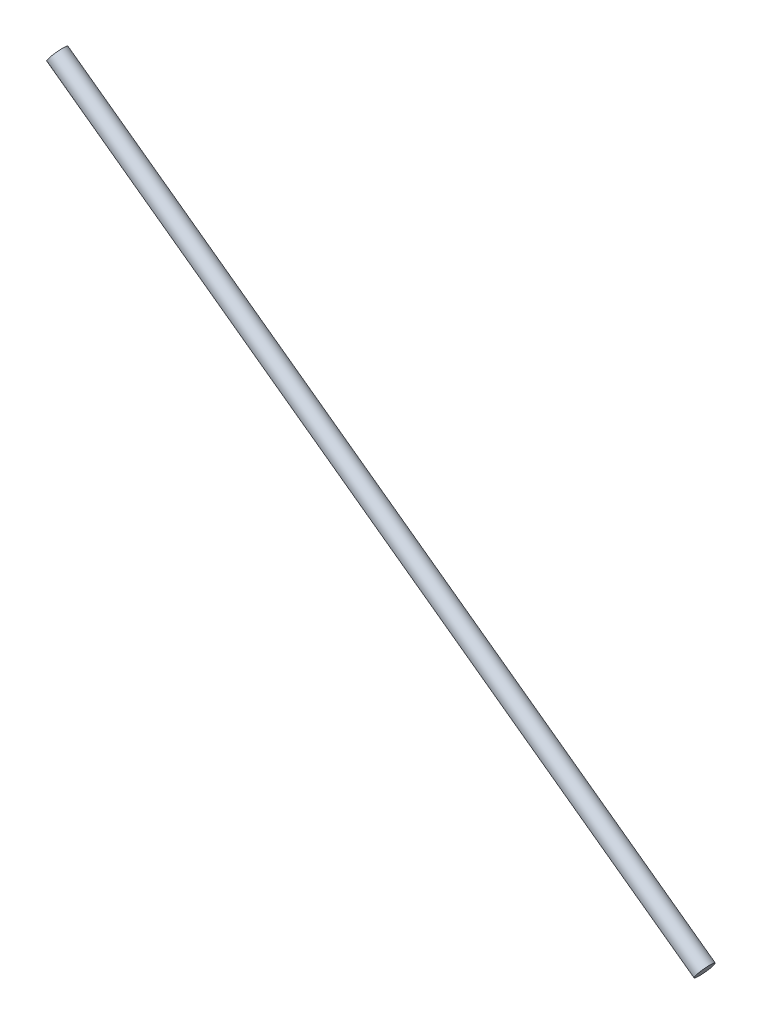
ISO-10303-21;
HEADER;
FILE_DESCRIPTION(('STEP AP214'),'2;1');
FILE_NAME('part.step','',(''),(''),'','','');
FILE_SCHEMA(('AUTOMOTIVE_DESIGN { 1 0 10303 214 1 1 1 1 }'));
ENDSEC;
DATA;
#1=APPLICATION_CONTEXT('core data for automotive mechanical design processes');
#2=APPLICATION_PROTOCOL_DEFINITION('international standard','automotive_design',2000,#1);
#3=PRODUCT_CONTEXT('',#1,'mechanical');
#4=PRODUCT('Part','Part','',(#3));
#5=PRODUCT_RELATED_PRODUCT_CATEGORY('part','',(#4));
#6=PRODUCT_DEFINITION_FORMATION('','',#4);
#7=PRODUCT_DEFINITION_CONTEXT('part definition',#1,'design');
#8=PRODUCT_DEFINITION('design','',#6,#7);
#9=PRODUCT_DEFINITION_SHAPE('','',#8);
#10=(LENGTH_UNIT() NAMED_UNIT(*) SI_UNIT(.MILLI.,.METRE.));
#11=(NAMED_UNIT(*) PLANE_ANGLE_UNIT() SI_UNIT($,.RADIAN.));
#12=(NAMED_UNIT(*) SI_UNIT($,.STERADIAN.) SOLID_ANGLE_UNIT());
#13=UNCERTAINTY_MEASURE_WITH_UNIT(LENGTH_MEASURE(1.E-05),#10,'distance_accuracy_value','');
#14=(GEOMETRIC_REPRESENTATION_CONTEXT(3) GLOBAL_UNCERTAINTY_ASSIGNED_CONTEXT((#13)) GLOBAL_UNIT_ASSIGNED_CONTEXT((#10,
#11,#12)) REPRESENTATION_CONTEXT('',''));
#15=CARTESIAN_POINT('',(0.,0.,0.));
#16=DIRECTION('',(0.,0.,1.));
#17=DIRECTION('',(1.,0.,0.));
#18=AXIS2_PLACEMENT_3D('',#15,#16,#17);
#19=CARTESIAN_POINT('',(178.792755756863,134.602822774976,0.));
#20=DIRECTION('',(-0.809016994374947,0.587785252292474,0.));
#21=DIRECTION('',(-0.587785252292474,-0.809016994374947,0.));
#22=AXIS2_PLACEMENT_3D('',#19,#20,#21);
#23=PLANE('',#22);
#24=CARTESIAN_POINT('',(178.792755756863,134.602822774976,0.));
#25=DIRECTION('',(-0.809016994374947,0.587785252292474,0.));
#26=DIRECTION('',(-0.587785252292474,-0.809016994374947,0.));
#27=AXIS2_PLACEMENT_3D('',#24,#25,#26);
#28=CIRCLE('',#27,1.5);
#29=CARTESIAN_POINT('',(177.911077878425,133.389297283414,0.));
#30=VERTEX_POINT('',#29);
#31=EDGE_CURVE('E37',#30,#30,#28,.T.);
#32=ORIENTED_EDGE('',*,*,#31,.F.);
#33=EDGE_LOOP('',(#32));
#34=FACE_BOUND('',#33,.T.);
#35=ADVANCED_FACE('F31',(#34),#23,.F.);
#36=CARTESIAN_POINT('',(72.764891711863,211.63657515724,0.));
#37=DIRECTION('',(-0.809016994374947,0.587785252292474,0.));
#38=DIRECTION('',(-0.587785252292474,-0.809016994374947,0.));
#39=AXIS2_PLACEMENT_3D('',#36,#37,#38);
#40=PLANE('',#39);
#41=CARTESIAN_POINT('',(72.764891711863,211.63657515724,0.));
#42=DIRECTION('',(-0.809016994374947,0.587785252292474,0.));
#43=DIRECTION('',(-0.587785252292474,-0.809016994374947,0.));
#44=AXIS2_PLACEMENT_3D('',#41,#42,#43);
#45=CIRCLE('',#44,1.5);
#46=CARTESIAN_POINT('',(71.8832138334243,210.423049665677,0.));
#47=VERTEX_POINT('',#46);
#48=EDGE_CURVE('E10',#47,#47,#45,.T.);
#49=ORIENTED_EDGE('',*,*,#48,.T.);
#50=EDGE_LOOP('',(#49));
#51=FACE_BOUND('',#50,.T.);
#52=ADVANCED_FACE('F46',(#51),#40,.T.);
#53=CARTESIAN_POINT('',(178.792755756863,134.602822774976,0.));
#54=DIRECTION('',(-0.809016994374948,0.587785252292473,0.));
#55=DIRECTION('',(-0.587785252292473,-0.809016994374948,0.));
#56=AXIS2_PLACEMENT_3D('',#53,#54,#55);
#57=CYLINDRICAL_SURFACE('',#56,1.5);
#58=ORIENTED_EDGE('',*,*,#48,.F.);
#59=EDGE_LOOP('',(#58));
#60=FACE_BOUND('',#59,.T.);
#61=ORIENTED_EDGE('',*,*,#31,.T.);
#62=EDGE_LOOP('',(#61));
#63=FACE_BOUND('',#62,.T.);
#64=ADVANCED_FACE('F43',(#60,#63),#57,.T.);
#65=CLOSED_SHELL('',(#35,#52,#64));
#66=MANIFOLD_SOLID_BREP('B2',#65);
#67=ADVANCED_BREP_SHAPE_REPRESENTATION('',(#18,#66),#14);
#68=SHAPE_DEFINITION_REPRESENTATION(#9,#67);
ENDSEC;
END-ISO-10303-21;
